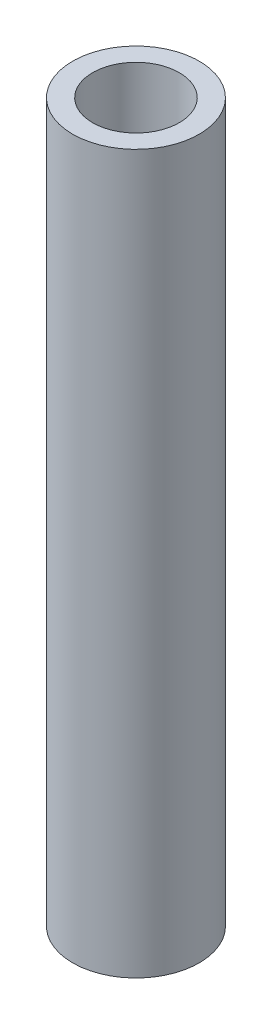
ISO-10303-21;
HEADER;
FILE_DESCRIPTION(('STEP AP214'),'2;1');
FILE_NAME('part.step','',(''),(''),'','','');
FILE_SCHEMA(('AUTOMOTIVE_DESIGN { 1 0 10303 214 1 1 1 1 }'));
ENDSEC;
DATA;
#1=APPLICATION_CONTEXT('core data for automotive mechanical design processes');
#2=APPLICATION_PROTOCOL_DEFINITION('international standard','automotive_design',2000,#1);
#3=PRODUCT_CONTEXT('',#1,'mechanical');
#4=PRODUCT('Part','Part','',(#3));
#5=PRODUCT_RELATED_PRODUCT_CATEGORY('part','',(#4));
#6=PRODUCT_DEFINITION_FORMATION('','',#4);
#7=PRODUCT_DEFINITION_CONTEXT('part definition',#1,'design');
#8=PRODUCT_DEFINITION('design','',#6,#7);
#9=PRODUCT_DEFINITION_SHAPE('','',#8);
#10=(LENGTH_UNIT() NAMED_UNIT(*) SI_UNIT(.MILLI.,.METRE.));
#11=(NAMED_UNIT(*) PLANE_ANGLE_UNIT() SI_UNIT($,.RADIAN.));
#12=(NAMED_UNIT(*) SI_UNIT($,.STERADIAN.) SOLID_ANGLE_UNIT());
#13=UNCERTAINTY_MEASURE_WITH_UNIT(LENGTH_MEASURE(1.E-05),#10,'distance_accuracy_value','');
#14=(GEOMETRIC_REPRESENTATION_CONTEXT(3) GLOBAL_UNCERTAINTY_ASSIGNED_CONTEXT((#13)) GLOBAL_UNIT_ASSIGNED_CONTEXT((#10,
#11,#12)) REPRESENTATION_CONTEXT('',''));
#15=CARTESIAN_POINT('',(0.,0.,0.));
#16=DIRECTION('',(0.,0.,1.));
#17=DIRECTION('',(1.,0.,0.));
#18=AXIS2_PLACEMENT_3D('',#15,#16,#17);
#19=CARTESIAN_POINT('',(-150.,127.,200.));
#20=DIRECTION('',(0.,1.,0.));
#21=DIRECTION('',(0.,0.,1.));
#22=AXIS2_PLACEMENT_3D('',#19,#20,#21);
#23=PLANE('',#22);
#24=CARTESIAN_POINT('',(-150.,127.,200.));
#25=DIRECTION('',(0.,1.,0.));
#26=DIRECTION('',(0.,0.,1.));
#27=AXIS2_PLACEMENT_3D('',#24,#25,#26);
#28=CIRCLE('',#27,2.17500000000001);
#29=CARTESIAN_POINT('',(-150.,127.,202.175));
#30=VERTEX_POINT('',#29);
#31=EDGE_CURVE('E61',#30,#30,#28,.T.);
#32=ORIENTED_EDGE('',*,*,#31,.T.);
#33=EDGE_LOOP('',(#32));
#34=FACE_BOUND('',#33,.T.);
#35=CARTESIAN_POINT('',(-150.,127.,200.));
#36=DIRECTION('',(0.,1.,0.));
#37=DIRECTION('',(0.,0.,1.));
#38=AXIS2_PLACEMENT_3D('',#35,#36,#37);
#39=CIRCLE('',#38,3.17500000000001);
#40=CARTESIAN_POINT('',(-150.,127.,203.175));
#41=VERTEX_POINT('',#40);
#42=EDGE_CURVE('E51',#41,#41,#39,.T.);
#43=ORIENTED_EDGE('',*,*,#42,.F.);
#44=EDGE_LOOP('',(#43));
#45=FACE_BOUND('',#44,.T.);
#46=ADVANCED_FACE('F50',(#34,#45),#23,.F.);
#47=CARTESIAN_POINT('',(-150.,163.,200.));
#48=DIRECTION('',(0.,1.,0.));
#49=DIRECTION('',(0.,0.,1.));
#50=AXIS2_PLACEMENT_3D('',#47,#48,#49);
#51=PLANE('',#50);
#52=CARTESIAN_POINT('',(-150.,163.,200.));
#53=DIRECTION('',(0.,1.,0.));
#54=DIRECTION('',(0.,0.,1.));
#55=AXIS2_PLACEMENT_3D('',#52,#53,#54);
#56=CIRCLE('',#55,2.17500000000001);
#57=CARTESIAN_POINT('',(-150.,163.,202.175));
#58=VERTEX_POINT('',#57);
#59=EDGE_CURVE('E59',#58,#58,#56,.T.);
#60=ORIENTED_EDGE('',*,*,#59,.F.);
#61=EDGE_LOOP('',(#60));
#62=FACE_BOUND('',#61,.T.);
#63=CARTESIAN_POINT('',(-150.,163.,200.));
#64=DIRECTION('',(0.,1.,0.));
#65=DIRECTION('',(0.,0.,1.));
#66=AXIS2_PLACEMENT_3D('',#63,#64,#65);
#67=CIRCLE('',#66,3.17500000000001);
#68=CARTESIAN_POINT('',(-150.,163.,203.175));
#69=VERTEX_POINT('',#68);
#70=EDGE_CURVE('E11',#69,#69,#67,.T.);
#71=ORIENTED_EDGE('',*,*,#70,.T.);
#72=EDGE_LOOP('',(#71));
#73=FACE_BOUND('',#72,.T.);
#74=ADVANCED_FACE('F73',(#62,#73),#51,.T.);
#75=CARTESIAN_POINT('',(-150.,127.,200.));
#76=DIRECTION('',(0.,1.,0.));
#77=DIRECTION('',(0.,0.,1.));
#78=AXIS2_PLACEMENT_3D('',#75,#76,#77);
#79=CYLINDRICAL_SURFACE('',#78,3.17500000000001);
#80=ORIENTED_EDGE('',*,*,#70,.F.);
#81=EDGE_LOOP('',(#80));
#82=FACE_BOUND('',#81,.T.);
#83=ORIENTED_EDGE('',*,*,#42,.T.);
#84=EDGE_LOOP('',(#83));
#85=FACE_BOUND('',#84,.T.);
#86=ADVANCED_FACE('F47',(#82,#85),#79,.T.);
#87=CARTESIAN_POINT('',(-150.,127.,200.));
#88=DIRECTION('',(0.,1.,0.));
#89=DIRECTION('',(0.,0.,1.));
#90=AXIS2_PLACEMENT_3D('',#87,#88,#89);
#91=CYLINDRICAL_SURFACE('',#90,2.17500000000001);
#92=ORIENTED_EDGE('',*,*,#59,.T.);
#93=EDGE_LOOP('',(#92));
#94=FACE_BOUND('',#93,.T.);
#95=ORIENTED_EDGE('',*,*,#31,.F.);
#96=EDGE_LOOP('',(#95));
#97=FACE_BOUND('',#96,.T.);
#98=ADVANCED_FACE('F67',(#94,#97),#91,.F.);
#99=CLOSED_SHELL('',(#46,#74,#86,#98));
#100=MANIFOLD_SOLID_BREP('B2',#99);
#101=ADVANCED_BREP_SHAPE_REPRESENTATION('',(#18,#100),#14);
#102=SHAPE_DEFINITION_REPRESENTATION(#9,#101);
ENDSEC;
END-ISO-10303-21;
